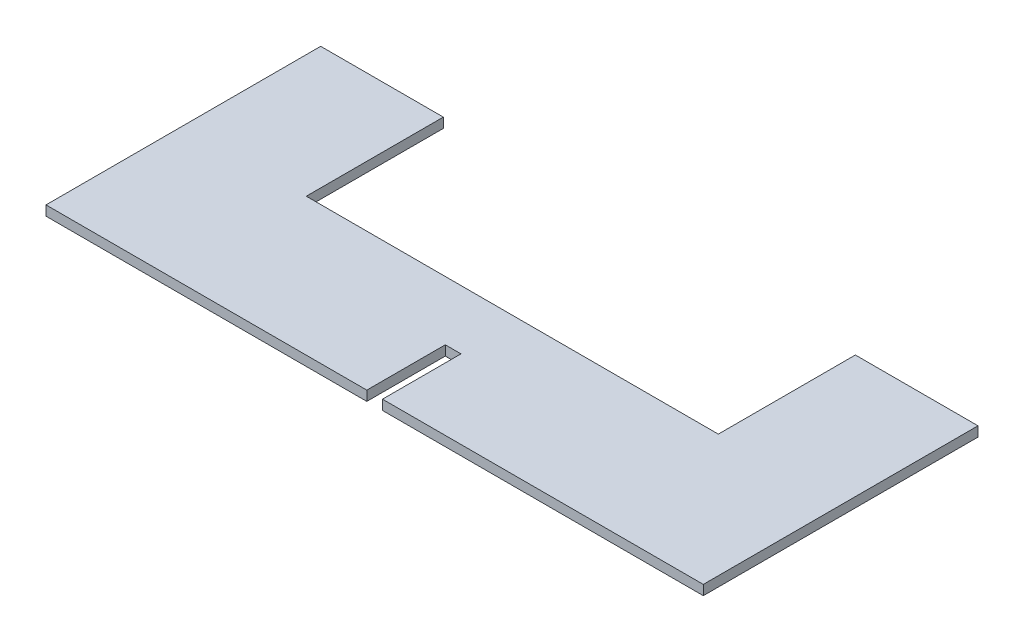
ISO-10303-21;
HEADER;
FILE_DESCRIPTION(('STEP AP214'),'2;1');
FILE_NAME('part.step','',(''),(''),'','','');
FILE_SCHEMA(('AUTOMOTIVE_DESIGN { 1 0 10303 214 1 1 1 1 }'));
ENDSEC;
DATA;
#1=APPLICATION_CONTEXT('core data for automotive mechanical design processes');
#2=APPLICATION_PROTOCOL_DEFINITION('international standard','automotive_design',2000,#1);
#3=PRODUCT_CONTEXT('',#1,'mechanical');
#4=PRODUCT('Part','Part','',(#3));
#5=PRODUCT_RELATED_PRODUCT_CATEGORY('part','',(#4));
#6=PRODUCT_DEFINITION_FORMATION('','',#4);
#7=PRODUCT_DEFINITION_CONTEXT('part definition',#1,'design');
#8=PRODUCT_DEFINITION('design','',#6,#7);
#9=PRODUCT_DEFINITION_SHAPE('','',#8);
#10=(LENGTH_UNIT() NAMED_UNIT(*) SI_UNIT(.MILLI.,.METRE.));
#11=(NAMED_UNIT(*) PLANE_ANGLE_UNIT() SI_UNIT($,.RADIAN.));
#12=(NAMED_UNIT(*) SI_UNIT($,.STERADIAN.) SOLID_ANGLE_UNIT());
#13=UNCERTAINTY_MEASURE_WITH_UNIT(LENGTH_MEASURE(1.E-05),#10,'distance_accuracy_value','');
#14=(GEOMETRIC_REPRESENTATION_CONTEXT(3) GLOBAL_UNCERTAINTY_ASSIGNED_CONTEXT((#13)) GLOBAL_UNIT_ASSIGNED_CONTEXT((#10,
#11,#12)) REPRESENTATION_CONTEXT('',''));
#15=CARTESIAN_POINT('',(0.,0.,0.));
#16=DIRECTION('',(0.,0.,1.));
#17=DIRECTION('',(1.,0.,0.));
#18=AXIS2_PLACEMENT_3D('',#15,#16,#17);
#19=CARTESIAN_POINT('',(16.35,0.5,0.));
#20=DIRECTION('',(-1.,0.,0.));
#21=DIRECTION('',(0.,0.,1.));
#22=AXIS2_PLACEMENT_3D('',#19,#20,#21);
#23=PLANE('',#22);
#24=DIRECTION('',(0.,0.,-1.));
#25=VECTOR('',#24,1.);
#26=CARTESIAN_POINT('',(16.35,0.,0.));
#27=LINE('',#26,#25);
#28=CARTESIAN_POINT('',(16.35,0.,0.));
#29=VERTEX_POINT('',#28);
#30=CARTESIAN_POINT('',(16.35,0.,-4.));
#31=VERTEX_POINT('',#30);
#32=EDGE_CURVE('E153',#29,#31,#27,.T.);
#33=ORIENTED_EDGE('',*,*,#32,.T.);
#34=DIRECTION('',(0.,-1.,0.));
#35=VECTOR('',#34,1.);
#36=CARTESIAN_POINT('',(16.35,0.5,-4.));
#37=LINE('',#36,#35);
#38=CARTESIAN_POINT('',(16.35,0.5,-4.));
#39=VERTEX_POINT('',#38);
#40=EDGE_CURVE('E11',#39,#31,#37,.T.);
#41=ORIENTED_EDGE('',*,*,#40,.F.);
#42=DIRECTION('',(0.,0.,-1.));
#43=VECTOR('',#42,1.);
#44=CARTESIAN_POINT('',(16.35,0.5,0.));
#45=LINE('',#44,#43);
#46=CARTESIAN_POINT('',(16.35,0.5,0.));
#47=VERTEX_POINT('',#46);
#48=EDGE_CURVE('E175',#47,#39,#45,.T.);
#49=ORIENTED_EDGE('',*,*,#48,.F.);
#50=DIRECTION('',(0.,-1.,0.));
#51=VECTOR('',#50,1.);
#52=CARTESIAN_POINT('',(16.35,0.5,0.));
#53=LINE('',#52,#51);
#54=EDGE_CURVE('E149',#47,#29,#53,.T.);
#55=ORIENTED_EDGE('',*,*,#54,.T.);
#56=EDGE_LOOP('',(#33,#41,#49,#55));
#57=FACE_BOUND('',#56,.T.);
#58=ADVANCED_FACE('F33',(#57),#23,.F.);
#59=CARTESIAN_POINT('',(16.35,0.5,-4.));
#60=DIRECTION('',(0.,0.,-1.));
#61=DIRECTION('',(-1.,0.,0.));
#62=AXIS2_PLACEMENT_3D('',#59,#60,#61);
#63=PLANE('',#62);
#64=DIRECTION('',(1.,0.,0.));
#65=VECTOR('',#64,1.);
#66=CARTESIAN_POINT('',(16.35,0.,-4.));
#67=LINE('',#66,#65);
#68=CARTESIAN_POINT('',(17.15,0.,-4.));
#69=VERTEX_POINT('',#68);
#70=EDGE_CURVE('E156',#31,#69,#67,.T.);
#71=ORIENTED_EDGE('',*,*,#70,.T.);
#72=DIRECTION('',(0.,-1.,0.));
#73=VECTOR('',#72,1.);
#74=CARTESIAN_POINT('',(17.15,0.5,-4.));
#75=LINE('',#74,#73);
#76=CARTESIAN_POINT('',(17.15,0.5,-4.));
#77=VERTEX_POINT('',#76);
#78=EDGE_CURVE('E41',#77,#69,#75,.T.);
#79=ORIENTED_EDGE('',*,*,#78,.F.);
#80=DIRECTION('',(1.,0.,0.));
#81=VECTOR('',#80,1.);
#82=CARTESIAN_POINT('',(16.35,0.5,-4.));
#83=LINE('',#82,#81);
#84=EDGE_CURVE('E104',#39,#77,#83,.T.);
#85=ORIENTED_EDGE('',*,*,#84,.F.);
#86=ORIENTED_EDGE('',*,*,#40,.T.);
#87=EDGE_LOOP('',(#71,#79,#85,#86));
#88=FACE_BOUND('',#87,.T.);
#89=ADVANCED_FACE('F253',(#88),#63,.F.);
#90=CARTESIAN_POINT('',(17.15,0.5,-4.));
#91=DIRECTION('',(1.,0.,0.));
#92=DIRECTION('',(0.,0.,-1.));
#93=AXIS2_PLACEMENT_3D('',#90,#91,#92);
#94=PLANE('',#93);
#95=DIRECTION('',(0.,0.,1.));
#96=VECTOR('',#95,1.);
#97=CARTESIAN_POINT('',(17.15,0.,-4.));
#98=LINE('',#97,#96);
#99=CARTESIAN_POINT('',(17.15,0.,0.));
#100=VERTEX_POINT('',#99);
#101=EDGE_CURVE('E158',#69,#100,#98,.T.);
#102=ORIENTED_EDGE('',*,*,#101,.T.);
#103=DIRECTION('',(0.,-1.,0.));
#104=VECTOR('',#103,1.);
#105=CARTESIAN_POINT('',(17.15,0.5,0.));
#106=LINE('',#105,#104);
#107=CARTESIAN_POINT('',(17.15,0.5,0.));
#108=VERTEX_POINT('',#107);
#109=EDGE_CURVE('E194',#108,#100,#106,.T.);
#110=ORIENTED_EDGE('',*,*,#109,.F.);
#111=DIRECTION('',(0.,0.,1.));
#112=VECTOR('',#111,1.);
#113=CARTESIAN_POINT('',(17.15,0.5,-4.));
#114=LINE('',#113,#112);
#115=EDGE_CURVE('E202',#77,#108,#114,.T.);
#116=ORIENTED_EDGE('',*,*,#115,.F.);
#117=ORIENTED_EDGE('',*,*,#78,.T.);
#118=EDGE_LOOP('',(#102,#110,#116,#117));
#119=FACE_BOUND('',#118,.T.);
#120=ADVANCED_FACE('F200',(#119),#94,.F.);
#121=CARTESIAN_POINT('',(17.15,0.5,0.));
#122=DIRECTION('',(0.,0.,-1.));
#123=DIRECTION('',(-1.,0.,0.));
#124=AXIS2_PLACEMENT_3D('',#121,#122,#123);
#125=PLANE('',#124);
#126=DIRECTION('',(1.,0.,0.));
#127=VECTOR('',#126,1.);
#128=CARTESIAN_POINT('',(17.15,0.,0.));
#129=LINE('',#128,#127);
#130=CARTESIAN_POINT('',(33.5,0.,0.));
#131=VERTEX_POINT('',#130);
#132=EDGE_CURVE('E160',#100,#131,#129,.T.);
#133=ORIENTED_EDGE('',*,*,#132,.T.);
#134=DIRECTION('',(0.,-1.,0.));
#135=VECTOR('',#134,1.);
#136=CARTESIAN_POINT('',(33.5,0.5,0.));
#137=LINE('',#136,#135);
#138=CARTESIAN_POINT('',(33.5,0.5,0.));
#139=VERTEX_POINT('',#138);
#140=EDGE_CURVE('E191',#139,#131,#137,.T.);
#141=ORIENTED_EDGE('',*,*,#140,.F.);
#142=DIRECTION('',(1.,0.,0.));
#143=VECTOR('',#142,1.);
#144=CARTESIAN_POINT('',(17.15,0.5,0.));
#145=LINE('',#144,#143);
#146=EDGE_CURVE('E220',#108,#139,#145,.T.);
#147=ORIENTED_EDGE('',*,*,#146,.F.);
#148=ORIENTED_EDGE('',*,*,#109,.T.);
#149=EDGE_LOOP('',(#133,#141,#147,#148));
#150=FACE_BOUND('',#149,.T.);
#151=ADVANCED_FACE('F211',(#150),#125,.F.);
#152=CARTESIAN_POINT('',(33.5,0.5,0.));
#153=DIRECTION('',(-1.,0.,0.));
#154=DIRECTION('',(0.,0.,1.));
#155=AXIS2_PLACEMENT_3D('',#152,#153,#154);
#156=PLANE('',#155);
#157=DIRECTION('',(0.,0.,-1.));
#158=VECTOR('',#157,1.);
#159=CARTESIAN_POINT('',(33.5,0.,0.));
#160=LINE('',#159,#158);
#161=CARTESIAN_POINT('',(33.5,0.,-14.));
#162=VERTEX_POINT('',#161);
#163=EDGE_CURVE('E162',#131,#162,#160,.T.);
#164=ORIENTED_EDGE('',*,*,#163,.T.);
#165=DIRECTION('',(0.,-1.,0.));
#166=VECTOR('',#165,1.);
#167=CARTESIAN_POINT('',(33.5,0.5,-14.));
#168=LINE('',#167,#166);
#169=CARTESIAN_POINT('',(33.5,0.5,-14.));
#170=VERTEX_POINT('',#169);
#171=EDGE_CURVE('E188',#170,#162,#168,.T.);
#172=ORIENTED_EDGE('',*,*,#171,.F.);
#173=DIRECTION('',(0.,0.,-1.));
#174=VECTOR('',#173,1.);
#175=CARTESIAN_POINT('',(33.5,0.5,0.));
#176=LINE('',#175,#174);
#177=EDGE_CURVE('E217',#139,#170,#176,.T.);
#178=ORIENTED_EDGE('',*,*,#177,.F.);
#179=ORIENTED_EDGE('',*,*,#140,.T.);
#180=EDGE_LOOP('',(#164,#172,#178,#179));
#181=FACE_BOUND('',#180,.T.);
#182=ADVANCED_FACE('F215',(#181),#156,.F.);
#183=CARTESIAN_POINT('',(33.5,0.5,-14.));
#184=DIRECTION('',(0.,0.,1.));
#185=DIRECTION('',(1.,0.,0.));
#186=AXIS2_PLACEMENT_3D('',#183,#184,#185);
#187=PLANE('',#186);
#188=DIRECTION('',(-1.,0.,0.));
#189=VECTOR('',#188,1.);
#190=CARTESIAN_POINT('',(33.5,0.,-14.));
#191=LINE('',#190,#189);
#192=CARTESIAN_POINT('',(27.25,0.,-14.));
#193=VERTEX_POINT('',#192);
#194=EDGE_CURVE('E164',#162,#193,#191,.T.);
#195=ORIENTED_EDGE('',*,*,#194,.T.);
#196=DIRECTION('',(0.,-1.,0.));
#197=VECTOR('',#196,1.);
#198=CARTESIAN_POINT('',(27.25,0.5,-14.));
#199=LINE('',#198,#197);
#200=CARTESIAN_POINT('',(27.25,0.5,-14.));
#201=VERTEX_POINT('',#200);
#202=EDGE_CURVE('E185',#201,#193,#199,.T.);
#203=ORIENTED_EDGE('',*,*,#202,.F.);
#204=DIRECTION('',(-1.,0.,0.));
#205=VECTOR('',#204,1.);
#206=CARTESIAN_POINT('',(33.5,0.5,-14.));
#207=LINE('',#206,#205);
#208=EDGE_CURVE('E219',#170,#201,#207,.T.);
#209=ORIENTED_EDGE('',*,*,#208,.F.);
#210=ORIENTED_EDGE('',*,*,#171,.T.);
#211=EDGE_LOOP('',(#195,#203,#209,#210));
#212=FACE_BOUND('',#211,.T.);
#213=ADVANCED_FACE('F266',(#212),#187,.F.);
#214=CARTESIAN_POINT('',(27.25,0.5,-14.));
#215=DIRECTION('',(1.,0.,0.));
#216=DIRECTION('',(0.,0.,-1.));
#217=AXIS2_PLACEMENT_3D('',#214,#215,#216);
#218=PLANE('',#217);
#219=DIRECTION('',(0.,0.,1.));
#220=VECTOR('',#219,1.);
#221=CARTESIAN_POINT('',(27.25,0.,-14.));
#222=LINE('',#221,#220);
#223=CARTESIAN_POINT('',(27.25,0.,-7.01515279453712));
#224=VERTEX_POINT('',#223);
#225=EDGE_CURVE('E166',#193,#224,#222,.T.);
#226=ORIENTED_EDGE('',*,*,#225,.T.);
#227=DIRECTION('',(0.,-1.,0.));
#228=VECTOR('',#227,1.);
#229=CARTESIAN_POINT('',(27.25,0.5,-7.01515279453712));
#230=LINE('',#229,#228);
#231=CARTESIAN_POINT('',(27.25,0.5,-7.01515279453712));
#232=VERTEX_POINT('',#231);
#233=EDGE_CURVE('E182',#232,#224,#230,.T.);
#234=ORIENTED_EDGE('',*,*,#233,.F.);
#235=DIRECTION('',(0.,0.,1.));
#236=VECTOR('',#235,1.);
#237=CARTESIAN_POINT('',(27.25,0.5,-14.));
#238=LINE('',#237,#236);
#239=EDGE_CURVE('E222',#201,#232,#238,.T.);
#240=ORIENTED_EDGE('',*,*,#239,.F.);
#241=ORIENTED_EDGE('',*,*,#202,.T.);
#242=EDGE_LOOP('',(#226,#234,#240,#241));
#243=FACE_BOUND('',#242,.T.);
#244=ADVANCED_FACE('F269',(#243),#218,.F.);
#245=CARTESIAN_POINT('',(27.25,0.5,-7.01515279453712));
#246=DIRECTION('',(0.,0.,1.));
#247=DIRECTION('',(1.,0.,0.));
#248=AXIS2_PLACEMENT_3D('',#245,#246,#247);
#249=PLANE('',#248);
#250=DIRECTION('',(-1.,0.,0.));
#251=VECTOR('',#250,1.);
#252=CARTESIAN_POINT('',(27.25,0.,-7.01515279453712));
#253=LINE('',#252,#251);
#254=CARTESIAN_POINT('',(6.25,0.,-7.01515279453712));
#255=VERTEX_POINT('',#254);
#256=EDGE_CURVE('E168',#224,#255,#253,.T.);
#257=ORIENTED_EDGE('',*,*,#256,.T.);
#258=DIRECTION('',(0.,-1.,0.));
#259=VECTOR('',#258,1.);
#260=CARTESIAN_POINT('',(6.25,0.5,-7.01515279453712));
#261=LINE('',#260,#259);
#262=CARTESIAN_POINT('',(6.25,0.5,-7.01515279453712));
#263=VERTEX_POINT('',#262);
#264=EDGE_CURVE('E179',#263,#255,#261,.T.);
#265=ORIENTED_EDGE('',*,*,#264,.F.);
#266=DIRECTION('',(-1.,0.,0.));
#267=VECTOR('',#266,1.);
#268=CARTESIAN_POINT('',(27.25,0.5,-7.01515279453712));
#269=LINE('',#268,#267);
#270=EDGE_CURVE('E228',#232,#263,#269,.T.);
#271=ORIENTED_EDGE('',*,*,#270,.F.);
#272=ORIENTED_EDGE('',*,*,#233,.T.);
#273=EDGE_LOOP('',(#257,#265,#271,#272));
#274=FACE_BOUND('',#273,.T.);
#275=ADVANCED_FACE('F234',(#274),#249,.F.);
#276=CARTESIAN_POINT('',(6.25,0.5,-7.01515279453712));
#277=DIRECTION('',(-1.,0.,0.));
#278=DIRECTION('',(0.,0.,1.));
#279=AXIS2_PLACEMENT_3D('',#276,#277,#278);
#280=PLANE('',#279);
#281=DIRECTION('',(0.,0.,-1.));
#282=VECTOR('',#281,1.);
#283=CARTESIAN_POINT('',(6.25,0.,-7.01515279453712));
#284=LINE('',#283,#282);
#285=CARTESIAN_POINT('',(6.25,0.,-14.));
#286=VERTEX_POINT('',#285);
#287=EDGE_CURVE('E170',#255,#286,#284,.T.);
#288=ORIENTED_EDGE('',*,*,#287,.T.);
#289=DIRECTION('',(0.,-1.,0.));
#290=VECTOR('',#289,1.);
#291=CARTESIAN_POINT('',(6.25,0.5,-14.));
#292=LINE('',#291,#290);
#293=CARTESIAN_POINT('',(6.25,0.5,-14.));
#294=VERTEX_POINT('',#293);
#295=EDGE_CURVE('E144',#294,#286,#292,.T.);
#296=ORIENTED_EDGE('',*,*,#295,.F.);
#297=DIRECTION('',(0.,0.,-1.));
#298=VECTOR('',#297,1.);
#299=CARTESIAN_POINT('',(6.25,0.5,-7.01515279453712));
#300=LINE('',#299,#298);
#301=EDGE_CURVE('E135',#263,#294,#300,.T.);
#302=ORIENTED_EDGE('',*,*,#301,.F.);
#303=ORIENTED_EDGE('',*,*,#264,.T.);
#304=EDGE_LOOP('',(#288,#296,#302,#303));
#305=FACE_BOUND('',#304,.T.);
#306=ADVANCED_FACE('F238',(#305),#280,.F.);
#307=CARTESIAN_POINT('',(6.25,0.5,-14.));
#308=DIRECTION('',(0.,0.,1.));
#309=DIRECTION('',(1.,0.,0.));
#310=AXIS2_PLACEMENT_3D('',#307,#308,#309);
#311=PLANE('',#310);
#312=DIRECTION('',(-1.,0.,0.));
#313=VECTOR('',#312,1.);
#314=CARTESIAN_POINT('',(6.25,0.,-14.));
#315=LINE('',#314,#313);
#316=CARTESIAN_POINT('',(0.,0.,-14.));
#317=VERTEX_POINT('',#316);
#318=EDGE_CURVE('E143',#286,#317,#315,.T.);
#319=ORIENTED_EDGE('',*,*,#318,.T.);
#320=DIRECTION('',(0.,-1.,0.));
#321=VECTOR('',#320,1.);
#322=CARTESIAN_POINT('',(0.,0.5,-14.));
#323=LINE('',#322,#321);
#324=CARTESIAN_POINT('',(0.,0.5,-14.));
#325=VERTEX_POINT('',#324);
#326=EDGE_CURVE('E140',#325,#317,#323,.T.);
#327=ORIENTED_EDGE('',*,*,#326,.F.);
#328=DIRECTION('',(-1.,0.,0.));
#329=VECTOR('',#328,1.);
#330=CARTESIAN_POINT('',(6.25,0.5,-14.));
#331=LINE('',#330,#329);
#332=EDGE_CURVE('E129',#294,#325,#331,.T.);
#333=ORIENTED_EDGE('',*,*,#332,.F.);
#334=ORIENTED_EDGE('',*,*,#295,.T.);
#335=EDGE_LOOP('',(#319,#327,#333,#334));
#336=FACE_BOUND('',#335,.T.);
#337=ADVANCED_FACE('F141',(#336),#311,.F.);
#338=CARTESIAN_POINT('',(0.,0.5,-14.));
#339=DIRECTION('',(1.,0.,0.));
#340=DIRECTION('',(0.,0.,-1.));
#341=AXIS2_PLACEMENT_3D('',#338,#339,#340);
#342=PLANE('',#341);
#343=DIRECTION('',(0.,0.,1.));
#344=VECTOR('',#343,1.);
#345=CARTESIAN_POINT('',(0.,0.,-14.));
#346=LINE('',#345,#344);
#347=CARTESIAN_POINT('',(0.,0.,0.));
#348=VERTEX_POINT('',#347);
#349=EDGE_CURVE('E90',#317,#348,#346,.T.);
#350=ORIENTED_EDGE('',*,*,#349,.T.);
#351=DIRECTION('',(0.,-1.,0.));
#352=VECTOR('',#351,1.);
#353=CARTESIAN_POINT('',(0.,0.5,0.));
#354=LINE('',#353,#352);
#355=CARTESIAN_POINT('',(0.,0.5,0.));
#356=VERTEX_POINT('',#355);
#357=EDGE_CURVE('E145',#356,#348,#354,.T.);
#358=ORIENTED_EDGE('',*,*,#357,.F.);
#359=DIRECTION('',(0.,0.,1.));
#360=VECTOR('',#359,1.);
#361=CARTESIAN_POINT('',(0.,0.5,-14.));
#362=LINE('',#361,#360);
#363=EDGE_CURVE('E133',#325,#356,#362,.T.);
#364=ORIENTED_EDGE('',*,*,#363,.F.);
#365=ORIENTED_EDGE('',*,*,#326,.T.);
#366=EDGE_LOOP('',(#350,#358,#364,#365));
#367=FACE_BOUND('',#366,.T.);
#368=ADVANCED_FACE('F147',(#367),#342,.F.);
#369=CARTESIAN_POINT('',(0.,0.5,0.));
#370=DIRECTION('',(0.,0.,-1.));
#371=DIRECTION('',(-1.,0.,0.));
#372=AXIS2_PLACEMENT_3D('',#369,#370,#371);
#373=PLANE('',#372);
#374=DIRECTION('',(1.,0.,0.));
#375=VECTOR('',#374,1.);
#376=CARTESIAN_POINT('',(0.,0.,0.));
#377=LINE('',#376,#375);
#378=EDGE_CURVE('E96',#348,#29,#377,.T.);
#379=ORIENTED_EDGE('',*,*,#378,.T.);
#380=ORIENTED_EDGE('',*,*,#54,.F.);
#381=DIRECTION('',(1.,0.,0.));
#382=VECTOR('',#381,1.);
#383=CARTESIAN_POINT('',(0.,0.5,0.));
#384=LINE('',#383,#382);
#385=EDGE_CURVE('E49',#356,#47,#384,.T.);
#386=ORIENTED_EDGE('',*,*,#385,.F.);
#387=ORIENTED_EDGE('',*,*,#357,.T.);
#388=EDGE_LOOP('',(#379,#380,#386,#387));
#389=FACE_BOUND('',#388,.T.);
#390=ADVANCED_FACE('F242',(#389),#373,.F.);
#391=CARTESIAN_POINT('',(0.,0.5,0.));
#392=DIRECTION('',(0.,-1.,0.));
#393=DIRECTION('',(0.,0.,-1.));
#394=AXIS2_PLACEMENT_3D('',#391,#392,#393);
#395=PLANE('',#394);
#396=ORIENTED_EDGE('',*,*,#48,.T.);
#397=ORIENTED_EDGE('',*,*,#84,.T.);
#398=ORIENTED_EDGE('',*,*,#115,.T.);
#399=ORIENTED_EDGE('',*,*,#146,.T.);
#400=ORIENTED_EDGE('',*,*,#177,.T.);
#401=ORIENTED_EDGE('',*,*,#208,.T.);
#402=ORIENTED_EDGE('',*,*,#239,.T.);
#403=ORIENTED_EDGE('',*,*,#270,.T.);
#404=ORIENTED_EDGE('',*,*,#301,.T.);
#405=ORIENTED_EDGE('',*,*,#332,.T.);
#406=ORIENTED_EDGE('',*,*,#363,.T.);
#407=ORIENTED_EDGE('',*,*,#385,.T.);
#408=EDGE_LOOP('',(#396,#397,#398,#399,#400,#401,#402,#403,#404,#405,#406,#407));
#409=FACE_BOUND('',#408,.T.);
#410=ADVANCED_FACE('F131',(#409),#395,.F.);
#411=CARTESIAN_POINT('',(0.,0.,0.));
#412=DIRECTION('',(0.,-1.,0.));
#413=DIRECTION('',(0.,0.,-1.));
#414=AXIS2_PLACEMENT_3D('',#411,#412,#413);
#415=PLANE('',#414);
#416=ORIENTED_EDGE('',*,*,#32,.F.);
#417=ORIENTED_EDGE('',*,*,#378,.F.);
#418=ORIENTED_EDGE('',*,*,#349,.F.);
#419=ORIENTED_EDGE('',*,*,#318,.F.);
#420=ORIENTED_EDGE('',*,*,#287,.F.);
#421=ORIENTED_EDGE('',*,*,#256,.F.);
#422=ORIENTED_EDGE('',*,*,#225,.F.);
#423=ORIENTED_EDGE('',*,*,#194,.F.);
#424=ORIENTED_EDGE('',*,*,#163,.F.);
#425=ORIENTED_EDGE('',*,*,#132,.F.);
#426=ORIENTED_EDGE('',*,*,#101,.F.);
#427=ORIENTED_EDGE('',*,*,#70,.F.);
#428=EDGE_LOOP('',(#416,#417,#418,#419,#420,#421,#422,#423,#424,#425,#426,#427));
#429=FACE_BOUND('',#428,.T.);
#430=ADVANCED_FACE('F206',(#429),#415,.T.);
#431=CLOSED_SHELL('',(#58,#89,#120,#151,#182,#213,#244,#275,#306,#337,#368,#390,#410,#430));
#432=MANIFOLD_SOLID_BREP('B2',#431);
#433=ADVANCED_BREP_SHAPE_REPRESENTATION('',(#18,#432),#14);
#434=SHAPE_DEFINITION_REPRESENTATION(#9,#433);
ENDSEC;
END-ISO-10303-21;
